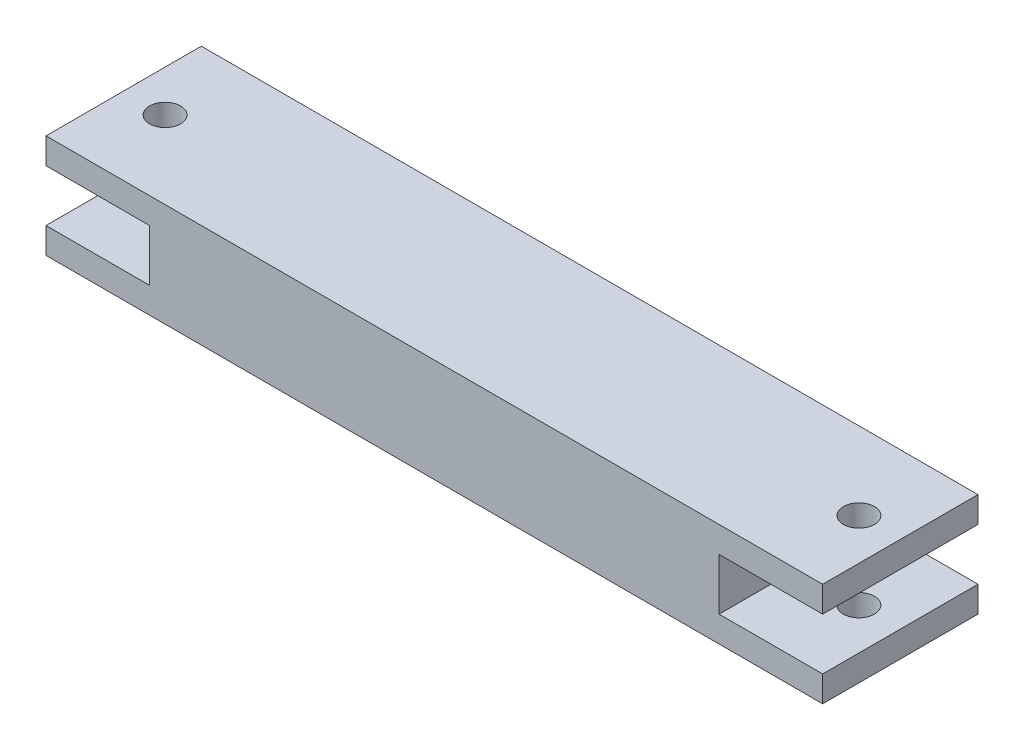
ISO-10303-21;
HEADER;
FILE_DESCRIPTION(('STEP AP214'),'2;1');
FILE_NAME('part.step','',(''),(''),'','','');
FILE_SCHEMA(('AUTOMOTIVE_DESIGN { 1 0 10303 214 1 1 1 1 }'));
ENDSEC;
DATA;
#1=APPLICATION_CONTEXT('core data for automotive mechanical design processes');
#2=APPLICATION_PROTOCOL_DEFINITION('international standard','automotive_design',2000,#1);
#3=PRODUCT_CONTEXT('',#1,'mechanical');
#4=PRODUCT('Part','Part','',(#3));
#5=PRODUCT_RELATED_PRODUCT_CATEGORY('part','',(#4));
#6=PRODUCT_DEFINITION_FORMATION('','',#4);
#7=PRODUCT_DEFINITION_CONTEXT('part definition',#1,'design');
#8=PRODUCT_DEFINITION('design','',#6,#7);
#9=PRODUCT_DEFINITION_SHAPE('','',#8);
#10=(LENGTH_UNIT() NAMED_UNIT(*) SI_UNIT(.MILLI.,.METRE.));
#11=(NAMED_UNIT(*) PLANE_ANGLE_UNIT() SI_UNIT($,.RADIAN.));
#12=(NAMED_UNIT(*) SI_UNIT($,.STERADIAN.) SOLID_ANGLE_UNIT());
#13=UNCERTAINTY_MEASURE_WITH_UNIT(LENGTH_MEASURE(1.E-05),#10,'distance_accuracy_value','');
#14=(GEOMETRIC_REPRESENTATION_CONTEXT(3) GLOBAL_UNCERTAINTY_ASSIGNED_CONTEXT((#13)) GLOBAL_UNIT_ASSIGNED_CONTEXT((#10,
#11,#12)) REPRESENTATION_CONTEXT('',''));
#15=CARTESIAN_POINT('',(0.,0.,0.));
#16=DIRECTION('',(0.,0.,1.));
#17=DIRECTION('',(1.,0.,0.));
#18=AXIS2_PLACEMENT_3D('',#15,#16,#17);
#19=CARTESIAN_POINT('',(91.1971830985916,20.,-17.0774647887324));
#20=DIRECTION('',(-1.,0.,0.));
#21=DIRECTION('',(0.,0.,1.));
#22=AXIS2_PLACEMENT_3D('',#19,#20,#21);
#23=PLANE('',#22);
#24=DIRECTION('',(0.,-1.,0.));
#25=VECTOR('',#24,1.);
#26=CARTESIAN_POINT('',(91.1971830985916,20.,12.9225352112676));
#27=LINE('',#26,#25);
#28=CARTESIAN_POINT('',(91.1971830985916,20.,12.9225352112676));
#29=VERTEX_POINT('',#28);
#30=CARTESIAN_POINT('',(91.1971830985916,15.,12.9225352112676));
#31=VERTEX_POINT('',#30);
#32=EDGE_CURVE('E216',#29,#31,#27,.T.);
#33=ORIENTED_EDGE('',*,*,#32,.T.);
#34=DIRECTION('',(0.,0.,1.));
#35=VECTOR('',#34,1.);
#36=CARTESIAN_POINT('',(91.1971830985916,15.,12.9225352112676));
#37=LINE('',#36,#35);
#38=CARTESIAN_POINT('',(91.1971830985916,15.,-17.0774647887324));
#39=VERTEX_POINT('',#38);
#40=EDGE_CURVE('E140',#39,#31,#37,.T.);
#41=ORIENTED_EDGE('',*,*,#40,.F.);
#42=DIRECTION('',(0.,-1.,0.));
#43=VECTOR('',#42,1.);
#44=CARTESIAN_POINT('',(91.1971830985916,20.,-17.0774647887324));
#45=LINE('',#44,#43);
#46=CARTESIAN_POINT('',(91.1971830985916,20.,-17.0774647887324));
#47=VERTEX_POINT('',#46);
#48=EDGE_CURVE('E213',#47,#39,#45,.T.);
#49=ORIENTED_EDGE('',*,*,#48,.F.);
#50=DIRECTION('',(0.,0.,-1.));
#51=VECTOR('',#50,1.);
#52=CARTESIAN_POINT('',(91.1971830985916,20.,-17.0774647887324));
#53=LINE('',#52,#51);
#54=EDGE_CURVE('E195',#29,#47,#53,.T.);
#55=ORIENTED_EDGE('',*,*,#54,.F.);
#56=EDGE_LOOP('',(#33,#41,#49,#55));
#57=FACE_BOUND('',#56,.T.);
#58=ADVANCED_FACE('F32',(#57),#23,.F.);
#59=CARTESIAN_POINT('',(83.1971830985916,0.,-2.07746478873234));
#60=DIRECTION('',(0.,1.,0.));
#61=DIRECTION('',(0.,0.,1.));
#62=AXIS2_PLACEMENT_3D('',#59,#60,#61);
#63=CYLINDRICAL_SURFACE('',#62,3.00000000000001);
#64=CARTESIAN_POINT('',(83.1971830985916,15.,-2.07746478873234));
#65=DIRECTION('',(0.,1.,0.));
#66=DIRECTION('',(0.,0.,1.));
#67=AXIS2_PLACEMENT_3D('',#64,#65,#66);
#68=CIRCLE('',#67,3.00000000000001);
#69=CARTESIAN_POINT('',(83.1971830985916,15.,0.922535211267663));
#70=VERTEX_POINT('',#69);
#71=EDGE_CURVE('E36',#70,#70,#68,.F.);
#72=ORIENTED_EDGE('',*,*,#71,.T.);
#73=EDGE_LOOP('',(#72));
#74=FACE_BOUND('',#73,.T.);
#75=CARTESIAN_POINT('',(83.1971830985916,20.,-2.07746478873234));
#76=DIRECTION('',(0.,1.,0.));
#77=DIRECTION('',(0.,0.,-1.));
#78=AXIS2_PLACEMENT_3D('',#75,#76,#77);
#79=CIRCLE('',#78,3.00000000000001);
#80=CARTESIAN_POINT('',(83.1971830985916,20.,-5.07746478873235));
#81=VERTEX_POINT('',#80);
#82=EDGE_CURVE('E185',#81,#81,#79,.T.);
#83=ORIENTED_EDGE('',*,*,#82,.T.);
#84=EDGE_LOOP('',(#83));
#85=FACE_BOUND('',#84,.T.);
#86=ADVANCED_FACE('F283',(#74,#85),#63,.F.);
#87=CARTESIAN_POINT('',(-58.8028169014084,20.,-17.0774647887324));
#88=DIRECTION('',(1.,0.,0.));
#89=DIRECTION('',(0.,0.,-1.));
#90=AXIS2_PLACEMENT_3D('',#87,#88,#89);
#91=PLANE('',#90);
#92=DIRECTION('',(0.,-1.,0.));
#93=VECTOR('',#92,1.);
#94=CARTESIAN_POINT('',(-58.8028169014084,20.,-17.0774647887324));
#95=LINE('',#94,#93);
#96=CARTESIAN_POINT('',(-58.8028169014084,20.,-17.0774647887324));
#97=VERTEX_POINT('',#96);
#98=CARTESIAN_POINT('',(-58.8028169014084,15.,-17.0774647887324));
#99=VERTEX_POINT('',#98);
#100=EDGE_CURVE('E209',#97,#99,#95,.T.);
#101=ORIENTED_EDGE('',*,*,#100,.T.);
#102=DIRECTION('',(0.,0.,-1.));
#103=VECTOR('',#102,1.);
#104=CARTESIAN_POINT('',(-58.8028169014084,15.,-17.0774647887324));
#105=LINE('',#104,#103);
#106=CARTESIAN_POINT('',(-58.8028169014084,15.,12.9225352112676));
#107=VERTEX_POINT('',#106);
#108=EDGE_CURVE('E155',#107,#99,#105,.T.);
#109=ORIENTED_EDGE('',*,*,#108,.F.);
#110=DIRECTION('',(0.,-1.,0.));
#111=VECTOR('',#110,1.);
#112=CARTESIAN_POINT('',(-58.8028169014084,20.,12.9225352112676));
#113=LINE('',#112,#111);
#114=CARTESIAN_POINT('',(-58.8028169014084,20.,12.9225352112676));
#115=VERTEX_POINT('',#114);
#116=EDGE_CURVE('E11',#115,#107,#113,.T.);
#117=ORIENTED_EDGE('',*,*,#116,.F.);
#118=DIRECTION('',(0.,0.,1.));
#119=VECTOR('',#118,1.);
#120=CARTESIAN_POINT('',(-58.8028169014084,20.,-17.0774647887324));
#121=LINE('',#120,#119);
#122=EDGE_CURVE('E189',#97,#115,#121,.T.);
#123=ORIENTED_EDGE('',*,*,#122,.F.);
#124=EDGE_LOOP('',(#101,#109,#117,#123));
#125=FACE_BOUND('',#124,.T.);
#126=ADVANCED_FACE('F253',(#125),#91,.F.);
#127=CARTESIAN_POINT('',(-50.8028169014084,0.,-2.07746478873241));
#128=DIRECTION('',(0.,1.,0.));
#129=DIRECTION('',(0.,0.,1.));
#130=AXIS2_PLACEMENT_3D('',#127,#128,#129);
#131=CYLINDRICAL_SURFACE('',#130,3.);
#132=CARTESIAN_POINT('',(-50.8028169014084,15.,-2.07746478873241));
#133=DIRECTION('',(0.,1.,0.));
#134=DIRECTION('',(0.,0.,1.));
#135=AXIS2_PLACEMENT_3D('',#132,#133,#134);
#136=CIRCLE('',#135,3.);
#137=CARTESIAN_POINT('',(-50.8028169014084,15.,0.922535211267595));
#138=VERTEX_POINT('',#137);
#139=EDGE_CURVE('E188',#138,#138,#136,.F.);
#140=ORIENTED_EDGE('',*,*,#139,.T.);
#141=EDGE_LOOP('',(#140));
#142=FACE_BOUND('',#141,.T.);
#143=CARTESIAN_POINT('',(-50.8028169014084,20.,-2.07746478873241));
#144=DIRECTION('',(0.,1.,0.));
#145=DIRECTION('',(0.,0.,1.));
#146=AXIS2_PLACEMENT_3D('',#143,#144,#145);
#147=CIRCLE('',#146,3.);
#148=CARTESIAN_POINT('',(-50.8028169014084,20.,0.922535211267595));
#149=VERTEX_POINT('',#148);
#150=EDGE_CURVE('E179',#149,#149,#147,.T.);
#151=ORIENTED_EDGE('',*,*,#150,.T.);
#152=EDGE_LOOP('',(#151));
#153=FACE_BOUND('',#152,.T.);
#154=ADVANCED_FACE('F293',(#142,#153),#131,.F.);
#155=CARTESIAN_POINT('',(-58.8028169014084,5.,12.9225352112676));
#156=VERTEX_POINT('',#155);
#157=CARTESIAN_POINT('',(-58.8028169014084,0.,12.9225352112676));
#158=VERTEX_POINT('',#157);
#159=EDGE_CURVE('E41',#156,#158,#113,.T.);
#160=ORIENTED_EDGE('',*,*,#159,.F.);
#161=DIRECTION('',(0.,0.,1.));
#162=VECTOR('',#161,1.);
#163=CARTESIAN_POINT('',(-58.8028169014084,5.,-17.0774647887324));
#164=LINE('',#163,#162);
#165=CARTESIAN_POINT('',(-58.8028169014084,5.,-17.0774647887324));
#166=VERTEX_POINT('',#165);
#167=EDGE_CURVE('E162',#166,#156,#164,.T.);
#168=ORIENTED_EDGE('',*,*,#167,.F.);
#169=CARTESIAN_POINT('',(-58.8028169014084,0.,-17.0774647887324));
#170=VERTEX_POINT('',#169);
#171=EDGE_CURVE('E199',#166,#170,#95,.T.);
#172=ORIENTED_EDGE('',*,*,#171,.T.);
#173=DIRECTION('',(0.,0.,1.));
#174=VECTOR('',#173,1.);
#175=CARTESIAN_POINT('',(-58.8028169014084,0.,-17.0774647887324));
#176=LINE('',#175,#174);
#177=EDGE_CURVE('E178',#170,#158,#176,.T.);
#178=ORIENTED_EDGE('',*,*,#177,.T.);
#179=EDGE_LOOP('',(#160,#168,#172,#178));
#180=FACE_BOUND('',#179,.T.);
#181=ADVANCED_FACE('F34',(#180),#91,.F.);
#182=CARTESIAN_POINT('',(-58.8028169014084,20.,12.9225352112676));
#183=DIRECTION('',(0.,0.,-1.));
#184=DIRECTION('',(-1.,0.,0.));
#185=AXIS2_PLACEMENT_3D('',#182,#183,#184);
#186=PLANE('',#185);
#187=DIRECTION('',(0.,-1.,0.));
#188=VECTOR('',#187,1.);
#189=CARTESIAN_POINT('',(71.1971830985916,15.,12.9225352112676));
#190=LINE('',#189,#188);
#191=CARTESIAN_POINT('',(71.1971830985916,15.,12.9225352112676));
#192=VERTEX_POINT('',#191);
#193=CARTESIAN_POINT('',(71.1971830985916,5.,12.9225352112676));
#194=VERTEX_POINT('',#193);
#195=EDGE_CURVE('E131',#192,#194,#190,.T.);
#196=ORIENTED_EDGE('',*,*,#195,.F.);
#197=DIRECTION('',(1.,0.,0.));
#198=VECTOR('',#197,1.);
#199=CARTESIAN_POINT('',(71.1971830985916,15.,12.9225352112676));
#200=LINE('',#199,#198);
#201=EDGE_CURVE('E224',#192,#31,#200,.T.);
#202=ORIENTED_EDGE('',*,*,#201,.T.);
#203=ORIENTED_EDGE('',*,*,#32,.F.);
#204=DIRECTION('',(1.,0.,0.));
#205=VECTOR('',#204,1.);
#206=CARTESIAN_POINT('',(-58.8028169014084,20.,12.9225352112676));
#207=LINE('',#206,#205);
#208=EDGE_CURVE('E192',#115,#29,#207,.T.);
#209=ORIENTED_EDGE('',*,*,#208,.F.);
#210=ORIENTED_EDGE('',*,*,#116,.T.);
#211=DIRECTION('',(-1.,0.,0.));
#212=VECTOR('',#211,1.);
#213=CARTESIAN_POINT('',(-38.8028169014084,15.,12.9225352112676));
#214=LINE('',#213,#212);
#215=CARTESIAN_POINT('',(-38.8028169014084,15.,12.9225352112676));
#216=VERTEX_POINT('',#215);
#217=EDGE_CURVE('E169',#216,#107,#214,.T.);
#218=ORIENTED_EDGE('',*,*,#217,.F.);
#219=DIRECTION('',(0.,1.,0.));
#220=VECTOR('',#219,1.);
#221=CARTESIAN_POINT('',(-38.8028169014084,15.,12.9225352112676));
#222=LINE('',#221,#220);
#223=CARTESIAN_POINT('',(-38.8028169014084,5.,12.9225352112676));
#224=VERTEX_POINT('',#223);
#225=EDGE_CURVE('E158',#224,#216,#222,.T.);
#226=ORIENTED_EDGE('',*,*,#225,.F.);
#227=DIRECTION('',(-1.,0.,0.));
#228=VECTOR('',#227,1.);
#229=CARTESIAN_POINT('',(-38.8028169014084,5.,12.9225352112676));
#230=LINE('',#229,#228);
#231=EDGE_CURVE('E171',#224,#156,#230,.T.);
#232=ORIENTED_EDGE('',*,*,#231,.T.);
#233=ORIENTED_EDGE('',*,*,#159,.T.);
#234=DIRECTION('',(1.,0.,0.));
#235=VECTOR('',#234,1.);
#236=CARTESIAN_POINT('',(-58.8028169014084,0.,12.9225352112676));
#237=LINE('',#236,#235);
#238=CARTESIAN_POINT('',(91.1971830985916,0.,12.9225352112676));
#239=VERTEX_POINT('',#238);
#240=EDGE_CURVE('E202',#158,#239,#237,.T.);
#241=ORIENTED_EDGE('',*,*,#240,.T.);
#242=CARTESIAN_POINT('',(91.1971830985916,5.,12.9225352112676));
#243=VERTEX_POINT('',#242);
#244=EDGE_CURVE('E145',#243,#239,#27,.T.);
#245=ORIENTED_EDGE('',*,*,#244,.F.);
#246=DIRECTION('',(1.,0.,0.));
#247=VECTOR('',#246,1.);
#248=CARTESIAN_POINT('',(71.1971830985916,5.,12.9225352112676));
#249=LINE('',#248,#247);
#250=EDGE_CURVE('E125',#194,#243,#249,.T.);
#251=ORIENTED_EDGE('',*,*,#250,.F.);
#252=EDGE_LOOP('',(#196,#202,#203,#209,#210,#218,#226,#232,#233,#241,#245,#251));
#253=FACE_BOUND('',#252,.T.);
#254=ADVANCED_FACE('F143',(#253),#186,.F.);
#255=CARTESIAN_POINT('',(91.1971830985916,5.,-17.0774647887324));
#256=VERTEX_POINT('',#255);
#257=CARTESIAN_POINT('',(91.1971830985916,0.,-17.0774647887324));
#258=VERTEX_POINT('',#257);
#259=EDGE_CURVE('E212',#256,#258,#45,.T.);
#260=ORIENTED_EDGE('',*,*,#259,.F.);
#261=DIRECTION('',(0.,0.,-1.));
#262=VECTOR('',#261,1.);
#263=CARTESIAN_POINT('',(91.1971830985916,5.,12.9225352112676));
#264=LINE('',#263,#262);
#265=EDGE_CURVE('E232',#243,#256,#264,.T.);
#266=ORIENTED_EDGE('',*,*,#265,.F.);
#267=ORIENTED_EDGE('',*,*,#244,.T.);
#268=DIRECTION('',(0.,0.,-1.));
#269=VECTOR('',#268,1.);
#270=CARTESIAN_POINT('',(91.1971830985916,0.,-17.0774647887324));
#271=LINE('',#270,#269);
#272=EDGE_CURVE('E204',#239,#258,#271,.T.);
#273=ORIENTED_EDGE('',*,*,#272,.T.);
#274=EDGE_LOOP('',(#260,#266,#267,#273));
#275=FACE_BOUND('',#274,.T.);
#276=ADVANCED_FACE('F274',(#275),#23,.F.);
#277=CARTESIAN_POINT('',(-58.8028169014084,20.,-17.0774647887324));
#278=DIRECTION('',(0.,0.,1.));
#279=DIRECTION('',(1.,0.,0.));
#280=AXIS2_PLACEMENT_3D('',#277,#278,#279);
#281=PLANE('',#280);
#282=ORIENTED_EDGE('',*,*,#48,.T.);
#283=DIRECTION('',(1.,0.,0.));
#284=VECTOR('',#283,1.);
#285=CARTESIAN_POINT('',(71.1971830985916,15.,-17.0774647887324));
#286=LINE('',#285,#284);
#287=CARTESIAN_POINT('',(71.1971830985916,15.,-17.0774647887324));
#288=VERTEX_POINT('',#287);
#289=EDGE_CURVE('E147',#288,#39,#286,.T.);
#290=ORIENTED_EDGE('',*,*,#289,.F.);
#291=DIRECTION('',(0.,1.,0.));
#292=VECTOR('',#291,1.);
#293=CARTESIAN_POINT('',(71.1971830985916,15.,-17.0774647887324));
#294=LINE('',#293,#292);
#295=CARTESIAN_POINT('',(71.1971830985916,5.,-17.0774647887324));
#296=VERTEX_POINT('',#295);
#297=EDGE_CURVE('E130',#296,#288,#294,.T.);
#298=ORIENTED_EDGE('',*,*,#297,.F.);
#299=DIRECTION('',(1.,0.,0.));
#300=VECTOR('',#299,1.);
#301=CARTESIAN_POINT('',(71.1971830985916,5.,-17.0774647887324));
#302=LINE('',#301,#300);
#303=EDGE_CURVE('E128',#296,#256,#302,.T.);
#304=ORIENTED_EDGE('',*,*,#303,.T.);
#305=ORIENTED_EDGE('',*,*,#259,.T.);
#306=DIRECTION('',(-1.,0.,0.));
#307=VECTOR('',#306,1.);
#308=CARTESIAN_POINT('',(-58.8028169014084,0.,-17.0774647887324));
#309=LINE('',#308,#307);
#310=EDGE_CURVE('E193',#258,#170,#309,.T.);
#311=ORIENTED_EDGE('',*,*,#310,.T.);
#312=ORIENTED_EDGE('',*,*,#171,.F.);
#313=DIRECTION('',(-1.,0.,0.));
#314=VECTOR('',#313,1.);
#315=CARTESIAN_POINT('',(-38.8028169014084,5.,-17.0774647887324));
#316=LINE('',#315,#314);
#317=CARTESIAN_POINT('',(-38.8028169014084,5.,-17.0774647887324));
#318=VERTEX_POINT('',#317);
#319=EDGE_CURVE('E161',#318,#166,#316,.T.);
#320=ORIENTED_EDGE('',*,*,#319,.F.);
#321=DIRECTION('',(0.,-1.,0.));
#322=VECTOR('',#321,1.);
#323=CARTESIAN_POINT('',(-38.8028169014084,15.,-17.0774647887324));
#324=LINE('',#323,#322);
#325=CARTESIAN_POINT('',(-38.8028169014084,15.,-17.0774647887324));
#326=VERTEX_POINT('',#325);
#327=EDGE_CURVE('E152',#326,#318,#324,.T.);
#328=ORIENTED_EDGE('',*,*,#327,.F.);
#329=DIRECTION('',(-1.,0.,0.));
#330=VECTOR('',#329,1.);
#331=CARTESIAN_POINT('',(-38.8028169014084,15.,-17.0774647887324));
#332=LINE('',#331,#330);
#333=EDGE_CURVE('E165',#326,#99,#332,.T.);
#334=ORIENTED_EDGE('',*,*,#333,.T.);
#335=ORIENTED_EDGE('',*,*,#100,.F.);
#336=DIRECTION('',(-1.,0.,0.));
#337=VECTOR('',#336,1.);
#338=CARTESIAN_POINT('',(-58.8028169014084,20.,-17.0774647887324));
#339=LINE('',#338,#337);
#340=EDGE_CURVE('E197',#47,#97,#339,.T.);
#341=ORIENTED_EDGE('',*,*,#340,.F.);
#342=EDGE_LOOP('',(#282,#290,#298,#304,#305,#311,#312,#320,#328,#334,#335,#341));
#343=FACE_BOUND('',#342,.T.);
#344=ADVANCED_FACE('F240',(#343),#281,.F.);
#345=CARTESIAN_POINT('',(0.,20.,0.));
#346=DIRECTION('',(0.,1.,0.));
#347=DIRECTION('',(0.,0.,1.));
#348=AXIS2_PLACEMENT_3D('',#345,#346,#347);
#349=PLANE('',#348);
#350=ORIENTED_EDGE('',*,*,#150,.F.);
#351=EDGE_LOOP('',(#350));
#352=FACE_BOUND('',#351,.T.);
#353=ORIENTED_EDGE('',*,*,#82,.F.);
#354=EDGE_LOOP('',(#353));
#355=FACE_BOUND('',#354,.T.);
#356=ORIENTED_EDGE('',*,*,#122,.T.);
#357=ORIENTED_EDGE('',*,*,#208,.T.);
#358=ORIENTED_EDGE('',*,*,#54,.T.);
#359=ORIENTED_EDGE('',*,*,#340,.T.);
#360=EDGE_LOOP('',(#356,#357,#358,#359));
#361=FACE_BOUND('',#360,.T.);
#362=ADVANCED_FACE('F250',(#352,#355,#361),#349,.T.);
#363=CARTESIAN_POINT('',(0.,0.,0.));
#364=DIRECTION('',(0.,1.,0.));
#365=DIRECTION('',(0.,0.,1.));
#366=AXIS2_PLACEMENT_3D('',#363,#364,#365);
#367=PLANE('',#366);
#368=CARTESIAN_POINT('',(-50.8028169014084,0.,-2.07746478873241));
#369=DIRECTION('',(0.,1.,0.));
#370=DIRECTION('',(0.,0.,1.));
#371=AXIS2_PLACEMENT_3D('',#368,#369,#370);
#372=CIRCLE('',#371,3.);
#373=CARTESIAN_POINT('',(-50.8028169014084,0.,0.922535211267595));
#374=VERTEX_POINT('',#373);
#375=EDGE_CURVE('E175',#374,#374,#372,.T.);
#376=ORIENTED_EDGE('',*,*,#375,.T.);
#377=EDGE_LOOP('',(#376));
#378=FACE_BOUND('',#377,.T.);
#379=CARTESIAN_POINT('',(83.1971830985916,0.,-2.07746478873234));
#380=DIRECTION('',(0.,1.,0.));
#381=DIRECTION('',(0.,0.,-1.));
#382=AXIS2_PLACEMENT_3D('',#379,#380,#381);
#383=CIRCLE('',#382,3.00000000000001);
#384=CARTESIAN_POINT('',(83.1971830985916,0.,-5.07746478873235));
#385=VERTEX_POINT('',#384);
#386=EDGE_CURVE('E182',#385,#385,#383,.T.);
#387=ORIENTED_EDGE('',*,*,#386,.T.);
#388=EDGE_LOOP('',(#387));
#389=FACE_BOUND('',#388,.T.);
#390=ORIENTED_EDGE('',*,*,#177,.F.);
#391=ORIENTED_EDGE('',*,*,#310,.F.);
#392=ORIENTED_EDGE('',*,*,#272,.F.);
#393=ORIENTED_EDGE('',*,*,#240,.F.);
#394=EDGE_LOOP('',(#390,#391,#392,#393));
#395=FACE_BOUND('',#394,.T.);
#396=ADVANCED_FACE('F270',(#378,#389,#395),#367,.F.);
#397=CARTESIAN_POINT('',(83.1971830985916,5.,-2.07746478873234));
#398=DIRECTION('',(0.,-1.,0.));
#399=DIRECTION('',(0.,0.,-1.));
#400=AXIS2_PLACEMENT_3D('',#397,#398,#399);
#401=CIRCLE('',#400,3.00000000000001);
#402=CARTESIAN_POINT('',(83.1971830985916,5.,-5.07746478873235));
#403=VERTEX_POINT('',#402);
#404=EDGE_CURVE('E222',#403,#403,#401,.F.);
#405=ORIENTED_EDGE('',*,*,#404,.T.);
#406=EDGE_LOOP('',(#405));
#407=FACE_BOUND('',#406,.T.);
#408=ORIENTED_EDGE('',*,*,#386,.F.);
#409=EDGE_LOOP('',(#408));
#410=FACE_BOUND('',#409,.T.);
#411=ADVANCED_FACE('F289',(#407,#410),#63,.F.);
#412=CARTESIAN_POINT('',(-50.8028169014084,5.,-2.07746478873241));
#413=DIRECTION('',(0.,-1.,0.));
#414=DIRECTION('',(0.,0.,-1.));
#415=AXIS2_PLACEMENT_3D('',#412,#413,#414);
#416=CIRCLE('',#415,3.);
#417=CARTESIAN_POINT('',(-50.8028169014084,5.,-5.07746478873241));
#418=VERTEX_POINT('',#417);
#419=EDGE_CURVE('E168',#418,#418,#416,.F.);
#420=ORIENTED_EDGE('',*,*,#419,.T.);
#421=EDGE_LOOP('',(#420));
#422=FACE_BOUND('',#421,.T.);
#423=ORIENTED_EDGE('',*,*,#375,.F.);
#424=EDGE_LOOP('',(#423));
#425=FACE_BOUND('',#424,.T.);
#426=ADVANCED_FACE('F298',(#422,#425),#131,.F.);
#427=CARTESIAN_POINT('',(-38.8028169014084,15.,-17.0774647887324));
#428=DIRECTION('',(0.,1.,0.));
#429=DIRECTION('',(0.,0.,1.));
#430=AXIS2_PLACEMENT_3D('',#427,#428,#429);
#431=PLANE('',#430);
#432=ORIENTED_EDGE('',*,*,#108,.T.);
#433=ORIENTED_EDGE('',*,*,#333,.F.);
#434=DIRECTION('',(0.,0.,-1.));
#435=VECTOR('',#434,1.);
#436=CARTESIAN_POINT('',(-38.8028169014084,15.,-17.0774647887324));
#437=LINE('',#436,#435);
#438=EDGE_CURVE('E57',#216,#326,#437,.T.);
#439=ORIENTED_EDGE('',*,*,#438,.F.);
#440=ORIENTED_EDGE('',*,*,#217,.T.);
#441=EDGE_LOOP('',(#432,#433,#439,#440));
#442=FACE_BOUND('',#441,.T.);
#443=ORIENTED_EDGE('',*,*,#139,.F.);
#444=EDGE_LOOP('',(#443));
#445=FACE_BOUND('',#444,.T.);
#446=ADVANCED_FACE('F255',(#442,#445),#431,.F.);
#447=CARTESIAN_POINT('',(-38.8028169014084,5.,-17.0774647887324));
#448=DIRECTION('',(0.,-1.,0.));
#449=DIRECTION('',(0.,0.,-1.));
#450=AXIS2_PLACEMENT_3D('',#447,#448,#449);
#451=PLANE('',#450);
#452=ORIENTED_EDGE('',*,*,#167,.T.);
#453=ORIENTED_EDGE('',*,*,#231,.F.);
#454=DIRECTION('',(0.,0.,1.));
#455=VECTOR('',#454,1.);
#456=CARTESIAN_POINT('',(-38.8028169014084,5.,-17.0774647887324));
#457=LINE('',#456,#455);
#458=EDGE_CURVE('E154',#318,#224,#457,.T.);
#459=ORIENTED_EDGE('',*,*,#458,.F.);
#460=ORIENTED_EDGE('',*,*,#319,.T.);
#461=EDGE_LOOP('',(#452,#453,#459,#460));
#462=FACE_BOUND('',#461,.T.);
#463=ORIENTED_EDGE('',*,*,#419,.F.);
#464=EDGE_LOOP('',(#463));
#465=FACE_BOUND('',#464,.T.);
#466=ADVANCED_FACE('F327',(#462,#465),#451,.F.);
#467=CARTESIAN_POINT('',(-38.8028169014084,0.,0.));
#468=DIRECTION('',(-1.,0.,0.));
#469=DIRECTION('',(0.,0.,1.));
#470=AXIS2_PLACEMENT_3D('',#467,#468,#469);
#471=PLANE('',#470);
#472=ORIENTED_EDGE('',*,*,#327,.T.);
#473=ORIENTED_EDGE('',*,*,#458,.T.);
#474=ORIENTED_EDGE('',*,*,#225,.T.);
#475=ORIENTED_EDGE('',*,*,#438,.T.);
#476=EDGE_LOOP('',(#472,#473,#474,#475));
#477=FACE_BOUND('',#476,.T.);
#478=ADVANCED_FACE('F260',(#477),#471,.T.);
#479=CARTESIAN_POINT('',(71.1971830985916,15.,12.9225352112676));
#480=DIRECTION('',(0.,1.,0.));
#481=DIRECTION('',(0.,0.,1.));
#482=AXIS2_PLACEMENT_3D('',#479,#480,#481);
#483=PLANE('',#482);
#484=ORIENTED_EDGE('',*,*,#40,.T.);
#485=ORIENTED_EDGE('',*,*,#201,.F.);
#486=DIRECTION('',(0.,0.,1.));
#487=VECTOR('',#486,1.);
#488=CARTESIAN_POINT('',(71.1971830985916,15.,12.9225352112676));
#489=LINE('',#488,#487);
#490=EDGE_CURVE('E137',#288,#192,#489,.T.);
#491=ORIENTED_EDGE('',*,*,#490,.F.);
#492=ORIENTED_EDGE('',*,*,#289,.T.);
#493=EDGE_LOOP('',(#484,#485,#491,#492));
#494=FACE_BOUND('',#493,.T.);
#495=ORIENTED_EDGE('',*,*,#71,.F.);
#496=EDGE_LOOP('',(#495));
#497=FACE_BOUND('',#496,.T.);
#498=ADVANCED_FACE('F237',(#494,#497),#483,.F.);
#499=CARTESIAN_POINT('',(71.1971830985916,5.,12.9225352112676));
#500=DIRECTION('',(0.,-1.,0.));
#501=DIRECTION('',(0.,0.,-1.));
#502=AXIS2_PLACEMENT_3D('',#499,#500,#501);
#503=PLANE('',#502);
#504=ORIENTED_EDGE('',*,*,#265,.T.);
#505=ORIENTED_EDGE('',*,*,#303,.F.);
#506=DIRECTION('',(0.,0.,-1.));
#507=VECTOR('',#506,1.);
#508=CARTESIAN_POINT('',(71.1971830985916,5.,12.9225352112676));
#509=LINE('',#508,#507);
#510=EDGE_CURVE('E49',#194,#296,#509,.T.);
#511=ORIENTED_EDGE('',*,*,#510,.F.);
#512=ORIENTED_EDGE('',*,*,#250,.T.);
#513=EDGE_LOOP('',(#504,#505,#511,#512));
#514=FACE_BOUND('',#513,.T.);
#515=ORIENTED_EDGE('',*,*,#404,.F.);
#516=EDGE_LOOP('',(#515));
#517=FACE_BOUND('',#516,.T.);
#518=ADVANCED_FACE('F122',(#514,#517),#503,.F.);
#519=CARTESIAN_POINT('',(71.1971830985916,0.,0.));
#520=DIRECTION('',(1.,0.,0.));
#521=DIRECTION('',(0.,0.,-1.));
#522=AXIS2_PLACEMENT_3D('',#519,#520,#521);
#523=PLANE('',#522);
#524=ORIENTED_EDGE('',*,*,#195,.T.);
#525=ORIENTED_EDGE('',*,*,#510,.T.);
#526=ORIENTED_EDGE('',*,*,#297,.T.);
#527=ORIENTED_EDGE('',*,*,#490,.T.);
#528=EDGE_LOOP('',(#524,#525,#526,#527));
#529=FACE_BOUND('',#528,.T.);
#530=ADVANCED_FACE('F135',(#529),#523,.T.);
#531=CLOSED_SHELL('',(#58,#86,#126,#154,#181,#254,#276,#344,#362,#396,#411,#426,#446,#466,#478,
#498,#518,#530));
#532=MANIFOLD_SOLID_BREP('B2',#531);
#533=ADVANCED_BREP_SHAPE_REPRESENTATION('',(#18,#532),#14);
#534=SHAPE_DEFINITION_REPRESENTATION(#9,#533);
ENDSEC;
END-ISO-10303-21;
